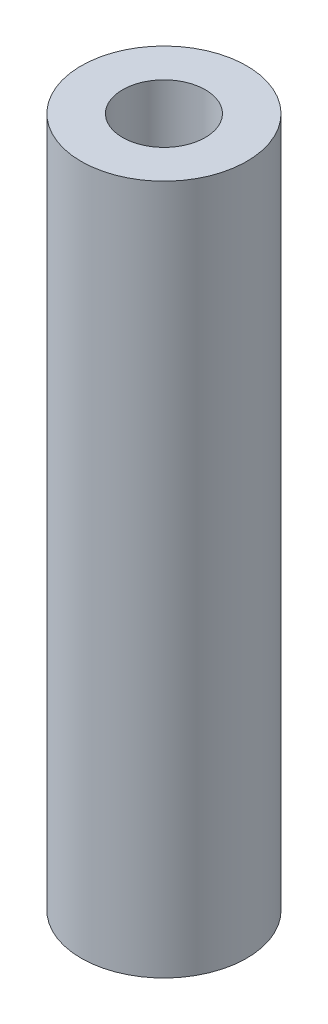
ISO-10303-21;
HEADER;
FILE_DESCRIPTION(('STEP AP214'),'2;1');
FILE_NAME('part.step','',(''),(''),'','','');
FILE_SCHEMA(('AUTOMOTIVE_DESIGN { 1 0 10303 214 1 1 1 1 }'));
ENDSEC;
DATA;
#1=APPLICATION_CONTEXT('core data for automotive mechanical design processes');
#2=APPLICATION_PROTOCOL_DEFINITION('international standard','automotive_design',2000,#1);
#3=PRODUCT_CONTEXT('',#1,'mechanical');
#4=PRODUCT('Part','Part','',(#3));
#5=PRODUCT_RELATED_PRODUCT_CATEGORY('part','',(#4));
#6=PRODUCT_DEFINITION_FORMATION('','',#4);
#7=PRODUCT_DEFINITION_CONTEXT('part definition',#1,'design');
#8=PRODUCT_DEFINITION('design','',#6,#7);
#9=PRODUCT_DEFINITION_SHAPE('','',#8);
#10=(LENGTH_UNIT() NAMED_UNIT(*) SI_UNIT(.MILLI.,.METRE.));
#11=(NAMED_UNIT(*) PLANE_ANGLE_UNIT() SI_UNIT($,.RADIAN.));
#12=(NAMED_UNIT(*) SI_UNIT($,.STERADIAN.) SOLID_ANGLE_UNIT());
#13=UNCERTAINTY_MEASURE_WITH_UNIT(LENGTH_MEASURE(1.E-05),#10,'distance_accuracy_value','');
#14=(GEOMETRIC_REPRESENTATION_CONTEXT(3) GLOBAL_UNCERTAINTY_ASSIGNED_CONTEXT((#13)) GLOBAL_UNIT_ASSIGNED_CONTEXT((#10,
#11,#12)) REPRESENTATION_CONTEXT('',''));
#15=CARTESIAN_POINT('',(0.,0.,0.));
#16=DIRECTION('',(0.,0.,1.));
#17=DIRECTION('',(1.,0.,0.));
#18=AXIS2_PLACEMENT_3D('',#15,#16,#17);
#19=CARTESIAN_POINT('',(0.,25.,0.));
#20=DIRECTION('',(0.,1.,0.));
#21=DIRECTION('',(0.,0.,1.));
#22=AXIS2_PLACEMENT_3D('',#19,#20,#21);
#23=PLANE('',#22);
#24=CARTESIAN_POINT('',(0.,25.,0.));
#25=DIRECTION('',(0.,1.,0.));
#26=DIRECTION('',(0.,0.,1.));
#27=AXIS2_PLACEMENT_3D('',#24,#25,#26);
#28=CIRCLE('',#27,3.);
#29=CARTESIAN_POINT('',(0.,25.,3.));
#30=VERTEX_POINT('',#29);
#31=EDGE_CURVE('E10',#30,#30,#28,.T.);
#32=ORIENTED_EDGE('',*,*,#31,.T.);
#33=EDGE_LOOP('',(#32));
#34=FACE_BOUND('',#33,.T.);
#35=CARTESIAN_POINT('',(0.,25.,0.));
#36=DIRECTION('',(0.,1.,0.));
#37=DIRECTION('',(0.,0.,1.));
#38=AXIS2_PLACEMENT_3D('',#35,#36,#37);
#39=CIRCLE('',#38,1.5);
#40=CARTESIAN_POINT('',(0.,25.,1.5));
#41=VERTEX_POINT('',#40);
#42=EDGE_CURVE('E50',#41,#41,#39,.T.);
#43=ORIENTED_EDGE('',*,*,#42,.F.);
#44=EDGE_LOOP('',(#43));
#45=FACE_BOUND('',#44,.T.);
#46=ADVANCED_FACE('F37',(#34,#45),#23,.T.);
#47=CARTESIAN_POINT('',(0.,0.,0.));
#48=DIRECTION('',(0.,1.,0.));
#49=DIRECTION('',(0.,0.,1.));
#50=AXIS2_PLACEMENT_3D('',#47,#48,#49);
#51=PLANE('',#50);
#52=CARTESIAN_POINT('',(0.,0.,0.));
#53=DIRECTION('',(0.,1.,0.));
#54=DIRECTION('',(0.,0.,1.));
#55=AXIS2_PLACEMENT_3D('',#52,#53,#54);
#56=CIRCLE('',#55,3.);
#57=CARTESIAN_POINT('',(0.,0.,3.));
#58=VERTEX_POINT('',#57);
#59=EDGE_CURVE('E41',#58,#58,#56,.T.);
#60=ORIENTED_EDGE('',*,*,#59,.F.);
#61=EDGE_LOOP('',(#60));
#62=FACE_BOUND('',#61,.T.);
#63=CARTESIAN_POINT('',(0.,0.,0.));
#64=DIRECTION('',(0.,1.,0.));
#65=DIRECTION('',(0.,0.,1.));
#66=AXIS2_PLACEMENT_3D('',#63,#64,#65);
#67=CIRCLE('',#66,1.5);
#68=CARTESIAN_POINT('',(0.,0.,1.5));
#69=VERTEX_POINT('',#68);
#70=EDGE_CURVE('E52',#69,#69,#67,.T.);
#71=ORIENTED_EDGE('',*,*,#70,.T.);
#72=EDGE_LOOP('',(#71));
#73=FACE_BOUND('',#72,.T.);
#74=ADVANCED_FACE('F64',(#62,#73),#51,.F.);
#75=CARTESIAN_POINT('',(0.,25.,0.));
#76=DIRECTION('',(0.,-1.,0.));
#77=DIRECTION('',(0.,0.,-1.));
#78=AXIS2_PLACEMENT_3D('',#75,#76,#77);
#79=CYLINDRICAL_SURFACE('',#78,3.);
#80=ORIENTED_EDGE('',*,*,#31,.F.);
#81=EDGE_LOOP('',(#80));
#82=FACE_BOUND('',#81,.T.);
#83=ORIENTED_EDGE('',*,*,#59,.T.);
#84=EDGE_LOOP('',(#83));
#85=FACE_BOUND('',#84,.T.);
#86=ADVANCED_FACE('F39',(#82,#85),#79,.T.);
#87=CARTESIAN_POINT('',(0.,25.,0.));
#88=DIRECTION('',(0.,-1.,0.));
#89=DIRECTION('',(0.,0.,-1.));
#90=AXIS2_PLACEMENT_3D('',#87,#88,#89);
#91=CYLINDRICAL_SURFACE('',#90,1.5);
#92=ORIENTED_EDGE('',*,*,#42,.T.);
#93=EDGE_LOOP('',(#92));
#94=FACE_BOUND('',#93,.T.);
#95=ORIENTED_EDGE('',*,*,#70,.F.);
#96=EDGE_LOOP('',(#95));
#97=FACE_BOUND('',#96,.T.);
#98=ADVANCED_FACE('F60',(#94,#97),#91,.F.);
#99=CLOSED_SHELL('',(#46,#74,#86,#98));
#100=MANIFOLD_SOLID_BREP('B2',#99);
#101=ADVANCED_BREP_SHAPE_REPRESENTATION('',(#18,#100),#14);
#102=SHAPE_DEFINITION_REPRESENTATION(#9,#101);
ENDSEC;
END-ISO-10303-21;
